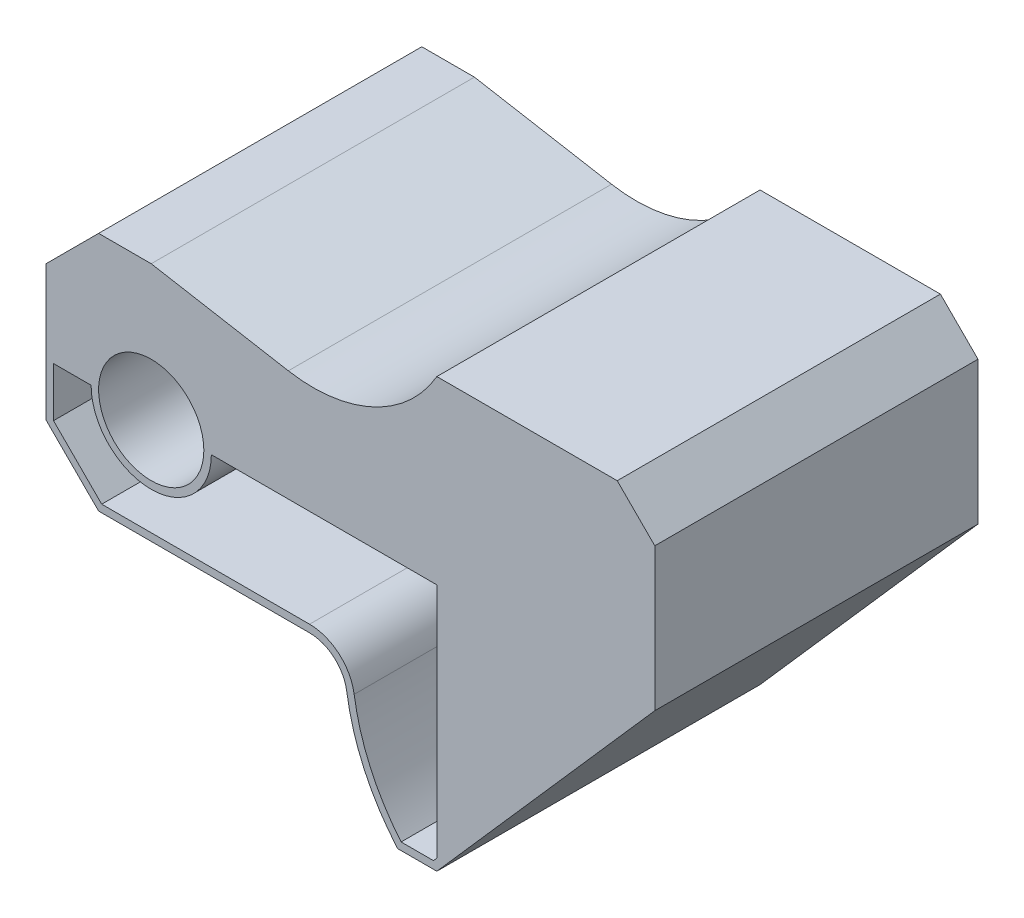
ISO-10303-21;
HEADER;
FILE_DESCRIPTION(('STEP AP214'),'2;1');
FILE_NAME('part.step','',(''),(''),'','','');
FILE_SCHEMA(('AUTOMOTIVE_DESIGN { 1 0 10303 214 1 1 1 1 }'));
ENDSEC;
DATA;
#1=APPLICATION_CONTEXT('core data for automotive mechanical design processes');
#2=APPLICATION_PROTOCOL_DEFINITION('international standard','automotive_design',2000,#1);
#3=PRODUCT_CONTEXT('',#1,'mechanical');
#4=PRODUCT('Part','Part','',(#3));
#5=PRODUCT_RELATED_PRODUCT_CATEGORY('part','',(#4));
#6=PRODUCT_DEFINITION_FORMATION('','',#4);
#7=PRODUCT_DEFINITION_CONTEXT('part definition',#1,'design');
#8=PRODUCT_DEFINITION('design','',#6,#7);
#9=PRODUCT_DEFINITION_SHAPE('','',#8);
#10=(LENGTH_UNIT() NAMED_UNIT(*) SI_UNIT(.MILLI.,.METRE.));
#11=(NAMED_UNIT(*) PLANE_ANGLE_UNIT() SI_UNIT($,.RADIAN.));
#12=(NAMED_UNIT(*) SI_UNIT($,.STERADIAN.) SOLID_ANGLE_UNIT());
#13=UNCERTAINTY_MEASURE_WITH_UNIT(LENGTH_MEASURE(1.E-05),#10,'distance_accuracy_value','');
#14=(GEOMETRIC_REPRESENTATION_CONTEXT(3) GLOBAL_UNCERTAINTY_ASSIGNED_CONTEXT((#13)) GLOBAL_UNIT_ASSIGNED_CONTEXT((#10,
#11,#12)) REPRESENTATION_CONTEXT('',''));
#15=CARTESIAN_POINT('',(0.,0.,0.));
#16=DIRECTION('',(0.,0.,1.));
#17=DIRECTION('',(1.,0.,0.));
#18=AXIS2_PLACEMENT_3D('',#15,#16,#17);
#19=CARTESIAN_POINT('',(21.0666262553692,-19.,43.));
#20=DIRECTION('',(0.,0.,-1.));
#21=DIRECTION('',(-1.,0.,0.));
#22=AXIS2_PLACEMENT_3D('',#19,#20,#21);
#23=PLANE('',#22);
#24=DIRECTION('',(1.,0.,0.));
#25=VECTOR('',#24,1.);
#26=CARTESIAN_POINT('',(-6.58578643762697,-13.,43.));
#27=LINE('',#26,#25);
#28=CARTESIAN_POINT('',(-6.58578643762697,-13.,43.));
#29=VERTEX_POINT('',#28);
#30=CARTESIAN_POINT('',(21.0666262553692,-13.,43.));
#31=VERTEX_POINT('',#30);
#32=EDGE_CURVE('E366',#29,#31,#27,.T.);
#33=ORIENTED_EDGE('',*,*,#32,.F.);
#34=DIRECTION('',(0.707106781186544,-0.707106781186551,0.));
#35=VECTOR('',#34,1.);
#36=CARTESIAN_POINT('',(-13.,-6.58578643762691,43.));
#37=LINE('',#36,#35);
#38=CARTESIAN_POINT('',(-13.,-6.58578643762691,43.));
#39=VERTEX_POINT('',#38);
#40=EDGE_CURVE('E363',#39,#29,#37,.T.);
#41=ORIENTED_EDGE('',*,*,#40,.F.);
#42=DIRECTION('',(0.,-1.,0.));
#43=VECTOR('',#42,1.);
#44=CARTESIAN_POINT('',(-13.,0.,43.));
#45=LINE('',#44,#43);
#46=CARTESIAN_POINT('',(-13.,0.,43.));
#47=VERTEX_POINT('',#46);
#48=EDGE_CURVE('E360',#47,#39,#45,.T.);
#49=ORIENTED_EDGE('',*,*,#48,.F.);
#50=DIRECTION('',(-1.,0.,0.));
#51=VECTOR('',#50,1.);
#52=CARTESIAN_POINT('',(-8.,0.,43.));
#53=LINE('',#52,#51);
#54=CARTESIAN_POINT('',(-8.,0.,43.));
#55=VERTEX_POINT('',#54);
#56=EDGE_CURVE('E51',#55,#47,#53,.T.);
#57=ORIENTED_EDGE('',*,*,#56,.F.);
#58=CARTESIAN_POINT('',(0.,0.,43.));
#59=DIRECTION('',(0.,0.,-1.));
#60=DIRECTION('',(1.,0.,0.));
#61=AXIS2_PLACEMENT_3D('',#58,#59,#60);
#62=CIRCLE('',#61,8.);
#63=CARTESIAN_POINT('',(8.,0.,43.));
#64=VERTEX_POINT('',#63);
#65=EDGE_CURVE('E387',#64,#55,#62,.T.);
#66=ORIENTED_EDGE('',*,*,#65,.F.);
#67=DIRECTION('',(-1.,0.,0.));
#68=VECTOR('',#67,1.);
#69=CARTESIAN_POINT('',(8.,0.,43.));
#70=LINE('',#69,#68);
#71=CARTESIAN_POINT('',(38.,0.,43.));
#72=VERTEX_POINT('',#71);
#73=EDGE_CURVE('E384',#72,#64,#70,.T.);
#74=ORIENTED_EDGE('',*,*,#73,.F.);
#75=DIRECTION('',(0.,1.,0.));
#76=VECTOR('',#75,1.);
#77=CARTESIAN_POINT('',(38.,0.,43.));
#78=LINE('',#77,#76);
#79=CARTESIAN_POINT('',(38.,-31.4851115423111,43.));
#80=VERTEX_POINT('',#79);
#81=EDGE_CURVE('E381',#80,#72,#78,.T.);
#82=ORIENTED_EDGE('',*,*,#81,.F.);
#83=DIRECTION('',(0.660114607728678,0.751164898449877,0.));
#84=VECTOR('',#83,1.);
#85=CARTESIAN_POINT('',(37.5475222644552,-32.,43.));
#86=LINE('',#85,#84);
#87=CARTESIAN_POINT('',(37.5475222644552,-32.,43.));
#88=VERTEX_POINT('',#87);
#89=EDGE_CURVE('E378',#88,#80,#86,.T.);
#90=ORIENTED_EDGE('',*,*,#89,.F.);
#91=DIRECTION('',(1.,0.,0.));
#92=VECTOR('',#91,1.);
#93=CARTESIAN_POINT('',(33.2493591074425,-32.,43.));
#94=LINE('',#93,#92);
#95=CARTESIAN_POINT('',(33.2493591074425,-32.,43.));
#96=VERTEX_POINT('',#95);
#97=EDGE_CURVE('E375',#96,#88,#94,.T.);
#98=ORIENTED_EDGE('',*,*,#97,.F.);
#99=CARTESIAN_POINT('',(54.6969696969697,-14.,43.));
#100=DIRECTION('',(0.,0.,1.));
#101=DIRECTION('',(1.,0.,0.));
#102=AXIS2_PLACEMENT_3D('',#99,#100,#101);
#103=CIRCLE('',#102,28.);
#104=CARTESIAN_POINT('',(27.0013927450634,-18.1176470588235,43.));
#105=VERTEX_POINT('',#104);
#106=EDGE_CURVE('E372',#105,#96,#103,.T.);
#107=ORIENTED_EDGE('',*,*,#106,.F.);
#108=CARTESIAN_POINT('',(21.0666262553692,-19.,43.));
#109=DIRECTION('',(0.,0.,-1.));
#110=DIRECTION('',(1.,0.,0.));
#111=AXIS2_PLACEMENT_3D('',#108,#109,#110);
#112=CIRCLE('',#111,6.);
#113=EDGE_CURVE('E369',#31,#105,#112,.T.);
#114=ORIENTED_EDGE('',*,*,#113,.F.);
#115=EDGE_LOOP('',(#33,#41,#49,#57,#66,#74,#82,#90,#98,#107,#114));
#116=FACE_BOUND('',#115,.T.);
#117=DIRECTION('',(0.707106781186544,-0.707106781186551,0.));
#118=VECTOR('',#117,1.);
#119=CARTESIAN_POINT('',(-14.,-7.,43.));
#120=LINE('',#119,#118);
#121=CARTESIAN_POINT('',(-14.,-7.,43.));
#122=VERTEX_POINT('',#121);
#123=CARTESIAN_POINT('',(-7.00000000000007,-14.,43.));
#124=VERTEX_POINT('',#123);
#125=EDGE_CURVE('E209',#122,#124,#120,.T.);
#126=ORIENTED_EDGE('',*,*,#125,.T.);
#127=DIRECTION('',(1.,0.,0.));
#128=VECTOR('',#127,1.);
#129=CARTESIAN_POINT('',(-7.00000000000007,-14.,43.));
#130=LINE('',#129,#128);
#131=CARTESIAN_POINT('',(21.0666262553692,-14.,43.));
#132=VERTEX_POINT('',#131);
#133=EDGE_CURVE('E119',#124,#132,#130,.T.);
#134=ORIENTED_EDGE('',*,*,#133,.T.);
#135=CARTESIAN_POINT('',(21.0666262553692,-19.,43.));
#136=DIRECTION('',(0.,0.,-1.));
#137=DIRECTION('',(-1.,0.,0.));
#138=AXIS2_PLACEMENT_3D('',#135,#136,#137);
#139=CIRCLE('',#138,5.);
#140=CARTESIAN_POINT('',(26.0122649967811,-18.2647058823529,43.));
#141=VERTEX_POINT('',#140);
#142=EDGE_CURVE('E242',#132,#141,#139,.T.);
#143=ORIENTED_EDGE('',*,*,#142,.T.);
#144=CARTESIAN_POINT('',(54.6969696969697,-14.,43.));
#145=DIRECTION('',(0.,0.,1.));
#146=DIRECTION('',(1.,0.,0.));
#147=AXIS2_PLACEMENT_3D('',#144,#145,#146);
#148=CIRCLE('',#147,29.);
#149=CARTESIAN_POINT('',(32.7880673967631,-33.,43.));
#150=VERTEX_POINT('',#149);
#151=EDGE_CURVE('E261',#141,#150,#148,.T.);
#152=ORIENTED_EDGE('',*,*,#151,.T.);
#153=DIRECTION('',(1.,0.,0.));
#154=VECTOR('',#153,1.);
#155=CARTESIAN_POINT('',(38.,-33.,43.));
#156=LINE('',#155,#154);
#157=CARTESIAN_POINT('',(38.,-33.,43.));
#158=VERTEX_POINT('',#157);
#159=EDGE_CURVE('E258',#150,#158,#156,.T.);
#160=ORIENTED_EDGE('',*,*,#159,.T.);
#161=DIRECTION('',(0.660114607728679,0.751164898449876,0.));
#162=VECTOR('',#161,1.);
#163=CARTESIAN_POINT('',(67.,0.,43.));
#164=LINE('',#163,#162);
#165=CARTESIAN_POINT('',(67.,0.,43.));
#166=VERTEX_POINT('',#165);
#167=EDGE_CURVE('E260',#158,#166,#164,.T.);
#168=ORIENTED_EDGE('',*,*,#167,.T.);
#169=DIRECTION('',(0.,1.,0.));
#170=VECTOR('',#169,1.);
#171=CARTESIAN_POINT('',(67.,19.,43.));
#172=LINE('',#171,#170);
#173=CARTESIAN_POINT('',(67.,19.,43.));
#174=VERTEX_POINT('',#173);
#175=EDGE_CURVE('E263',#166,#174,#172,.T.);
#176=ORIENTED_EDGE('',*,*,#175,.T.);
#177=DIRECTION('',(-0.707106781186547,0.707106781186548,0.));
#178=VECTOR('',#177,1.);
#179=CARTESIAN_POINT('',(62.,24.,43.));
#180=LINE('',#179,#178);
#181=CARTESIAN_POINT('',(62.,24.,43.));
#182=VERTEX_POINT('',#181);
#183=EDGE_CURVE('E269',#174,#182,#180,.T.);
#184=ORIENTED_EDGE('',*,*,#183,.T.);
#185=DIRECTION('',(-1.,0.,0.));
#186=VECTOR('',#185,1.);
#187=CARTESIAN_POINT('',(38.,24.,43.));
#188=LINE('',#187,#186);
#189=CARTESIAN_POINT('',(38.,24.,43.));
#190=VERTEX_POINT('',#189);
#191=EDGE_CURVE('E271',#182,#190,#188,.T.);
#192=ORIENTED_EDGE('',*,*,#191,.T.);
#193=CARTESIAN_POINT('',(21.5424003635473,33.4945992125119,43.));
#194=DIRECTION('',(0.,0.,-1.));
#195=DIRECTION('',(1.,0.,0.));
#196=AXIS2_PLACEMENT_3D('',#193,#194,#195);
#197=CIRCLE('',#196,19.);
#198=CARTESIAN_POINT('',(18.2430849878756,14.78325190528,43.));
#199=VERTEX_POINT('',#198);
#200=EDGE_CURVE('E273',#190,#199,#197,.T.);
#201=ORIENTED_EDGE('',*,*,#200,.T.);
#202=DIRECTION('',(-0.984807753012208,0.173648177666931,0.));
#203=VECTOR('',#202,1.);
#204=CARTESIAN_POINT('',(0.,18.,43.));
#205=LINE('',#204,#203);
#206=CARTESIAN_POINT('',(0.,18.,43.));
#207=VERTEX_POINT('',#206);
#208=EDGE_CURVE('E160',#199,#207,#205,.T.);
#209=ORIENTED_EDGE('',*,*,#208,.T.);
#210=DIRECTION('',(-1.,0.,0.));
#211=VECTOR('',#210,1.);
#212=CARTESIAN_POINT('',(-6.99999999999998,18.,43.));
#213=LINE('',#212,#211);
#214=CARTESIAN_POINT('',(-6.99999999999998,18.,43.));
#215=VERTEX_POINT('',#214);
#216=EDGE_CURVE('E153',#207,#215,#213,.T.);
#217=ORIENTED_EDGE('',*,*,#216,.T.);
#218=DIRECTION('',(-0.707106781186549,-0.707106781186546,0.));
#219=VECTOR('',#218,1.);
#220=CARTESIAN_POINT('',(-14.,11.,43.));
#221=LINE('',#220,#219);
#222=CARTESIAN_POINT('',(-14.,11.,43.));
#223=VERTEX_POINT('',#222);
#224=EDGE_CURVE('E157',#215,#223,#221,.T.);
#225=ORIENTED_EDGE('',*,*,#224,.T.);
#226=DIRECTION('',(0.,-1.,0.));
#227=VECTOR('',#226,1.);
#228=CARTESIAN_POINT('',(-14.,-7.,43.));
#229=LINE('',#228,#227);
#230=EDGE_CURVE('E60',#223,#122,#229,.T.);
#231=ORIENTED_EDGE('',*,*,#230,.T.);
#232=EDGE_LOOP('',(#126,#134,#143,#152,#160,#168,#176,#184,#192,#201,#209,#217,#225,#231));
#233=FACE_BOUND('',#232,.T.);
#234=CARTESIAN_POINT('',(0.,0.,43.));
#235=DIRECTION('',(0.,0.,1.));
#236=DIRECTION('',(1.,0.,0.));
#237=AXIS2_PLACEMENT_3D('',#234,#235,#236);
#238=CIRCLE('',#237,7.);
#239=CARTESIAN_POINT('',(7.,0.,43.));
#240=VERTEX_POINT('',#239);
#241=EDGE_CURVE('E185',#240,#240,#238,.T.);
#242=ORIENTED_EDGE('',*,*,#241,.F.);
#243=EDGE_LOOP('',(#242));
#244=FACE_BOUND('',#243,.T.);
#245=ADVANCED_FACE('F36',(#116,#233,#244),#23,.F.);
#246=CARTESIAN_POINT('',(21.0666262553692,-19.,0.));
#247=DIRECTION('',(0.,0.,-1.));
#248=DIRECTION('',(-1.,0.,0.));
#249=AXIS2_PLACEMENT_3D('',#246,#247,#248);
#250=PLANE('',#249);
#251=DIRECTION('',(0.707106781186544,-0.707106781186551,0.));
#252=VECTOR('',#251,1.);
#253=CARTESIAN_POINT('',(-14.,-7.,0.));
#254=LINE('',#253,#252);
#255=CARTESIAN_POINT('',(-14.,-7.,0.));
#256=VERTEX_POINT('',#255);
#257=CARTESIAN_POINT('',(-7.00000000000007,-14.,0.));
#258=VERTEX_POINT('',#257);
#259=EDGE_CURVE('E181',#256,#258,#254,.T.);
#260=ORIENTED_EDGE('',*,*,#259,.F.);
#261=DIRECTION('',(0.,-1.,0.));
#262=VECTOR('',#261,1.);
#263=CARTESIAN_POINT('',(-14.,-7.,0.));
#264=LINE('',#263,#262);
#265=CARTESIAN_POINT('',(-14.,11.,0.));
#266=VERTEX_POINT('',#265);
#267=EDGE_CURVE('E111',#266,#256,#264,.T.);
#268=ORIENTED_EDGE('',*,*,#267,.F.);
#269=DIRECTION('',(-0.707106781186549,-0.707106781186546,0.));
#270=VECTOR('',#269,1.);
#271=CARTESIAN_POINT('',(-14.,11.,0.));
#272=LINE('',#271,#270);
#273=CARTESIAN_POINT('',(-6.99999999999998,18.,0.));
#274=VERTEX_POINT('',#273);
#275=EDGE_CURVE('E206',#274,#266,#272,.T.);
#276=ORIENTED_EDGE('',*,*,#275,.F.);
#277=DIRECTION('',(-1.,0.,0.));
#278=VECTOR('',#277,1.);
#279=CARTESIAN_POINT('',(-6.99999999999998,18.,0.));
#280=LINE('',#279,#278);
#281=CARTESIAN_POINT('',(0.,18.,0.));
#282=VERTEX_POINT('',#281);
#283=EDGE_CURVE('E169',#282,#274,#280,.T.);
#284=ORIENTED_EDGE('',*,*,#283,.F.);
#285=DIRECTION('',(-0.984807753012208,0.173648177666931,0.));
#286=VECTOR('',#285,1.);
#287=CARTESIAN_POINT('',(0.,18.,0.));
#288=LINE('',#287,#286);
#289=CARTESIAN_POINT('',(18.2430849878756,14.78325190528,0.));
#290=VERTEX_POINT('',#289);
#291=EDGE_CURVE('E203',#290,#282,#288,.T.);
#292=ORIENTED_EDGE('',*,*,#291,.F.);
#293=CARTESIAN_POINT('',(21.5424003635473,33.4945992125119,0.));
#294=DIRECTION('',(0.,0.,-1.));
#295=DIRECTION('',(1.,0.,0.));
#296=AXIS2_PLACEMENT_3D('',#293,#294,#295);
#297=CIRCLE('',#296,19.);
#298=CARTESIAN_POINT('',(38.,24.,0.));
#299=VERTEX_POINT('',#298);
#300=EDGE_CURVE('E201',#299,#290,#297,.T.);
#301=ORIENTED_EDGE('',*,*,#300,.F.);
#302=DIRECTION('',(-1.,0.,0.));
#303=VECTOR('',#302,1.);
#304=CARTESIAN_POINT('',(38.,24.,0.));
#305=LINE('',#304,#303);
#306=CARTESIAN_POINT('',(62.,24.,0.));
#307=VERTEX_POINT('',#306);
#308=EDGE_CURVE('E199',#307,#299,#305,.T.);
#309=ORIENTED_EDGE('',*,*,#308,.F.);
#310=DIRECTION('',(-0.707106781186547,0.707106781186548,0.));
#311=VECTOR('',#310,1.);
#312=CARTESIAN_POINT('',(62.,24.,0.));
#313=LINE('',#312,#311);
#314=CARTESIAN_POINT('',(67.,19.,0.));
#315=VERTEX_POINT('',#314);
#316=EDGE_CURVE('E197',#315,#307,#313,.T.);
#317=ORIENTED_EDGE('',*,*,#316,.F.);
#318=DIRECTION('',(0.,1.,0.));
#319=VECTOR('',#318,1.);
#320=CARTESIAN_POINT('',(67.,19.,0.));
#321=LINE('',#320,#319);
#322=CARTESIAN_POINT('',(67.,0.,0.));
#323=VERTEX_POINT('',#322);
#324=EDGE_CURVE('E195',#323,#315,#321,.T.);
#325=ORIENTED_EDGE('',*,*,#324,.F.);
#326=DIRECTION('',(0.660114607728679,0.751164898449876,0.));
#327=VECTOR('',#326,1.);
#328=CARTESIAN_POINT('',(67.,0.,0.));
#329=LINE('',#328,#327);
#330=CARTESIAN_POINT('',(38.,-33.,0.));
#331=VERTEX_POINT('',#330);
#332=EDGE_CURVE('E193',#331,#323,#329,.T.);
#333=ORIENTED_EDGE('',*,*,#332,.F.);
#334=DIRECTION('',(1.,0.,0.));
#335=VECTOR('',#334,1.);
#336=CARTESIAN_POINT('',(38.,-33.,0.));
#337=LINE('',#336,#335);
#338=CARTESIAN_POINT('',(32.7880673967631,-33.,0.));
#339=VERTEX_POINT('',#338);
#340=EDGE_CURVE('E191',#339,#331,#337,.T.);
#341=ORIENTED_EDGE('',*,*,#340,.F.);
#342=CARTESIAN_POINT('',(54.6969696969697,-14.,0.));
#343=DIRECTION('',(0.,0.,1.));
#344=DIRECTION('',(1.,0.,0.));
#345=AXIS2_PLACEMENT_3D('',#342,#343,#344);
#346=CIRCLE('',#345,29.);
#347=CARTESIAN_POINT('',(26.0122649967811,-18.2647058823529,0.));
#348=VERTEX_POINT('',#347);
#349=EDGE_CURVE('E189',#348,#339,#346,.T.);
#350=ORIENTED_EDGE('',*,*,#349,.F.);
#351=CARTESIAN_POINT('',(21.0666262553692,-19.,0.));
#352=DIRECTION('',(0.,0.,-1.));
#353=DIRECTION('',(-1.,0.,0.));
#354=AXIS2_PLACEMENT_3D('',#351,#352,#353);
#355=CIRCLE('',#354,5.);
#356=CARTESIAN_POINT('',(21.0666262553692,-14.,0.));
#357=VERTEX_POINT('',#356);
#358=EDGE_CURVE('E187',#357,#348,#355,.T.);
#359=ORIENTED_EDGE('',*,*,#358,.F.);
#360=DIRECTION('',(1.,0.,0.));
#361=VECTOR('',#360,1.);
#362=CARTESIAN_POINT('',(-7.00000000000007,-14.,0.));
#363=LINE('',#362,#361);
#364=EDGE_CURVE('E184',#258,#357,#363,.T.);
#365=ORIENTED_EDGE('',*,*,#364,.F.);
#366=EDGE_LOOP('',(#260,#268,#276,#284,#292,#301,#309,#317,#325,#333,#341,#350,#359,#365));
#367=FACE_BOUND('',#366,.T.);
#368=CARTESIAN_POINT('',(0.,0.,0.));
#369=DIRECTION('',(0.,0.,1.));
#370=DIRECTION('',(1.,0.,0.));
#371=AXIS2_PLACEMENT_3D('',#368,#369,#370);
#372=CIRCLE('',#371,7.);
#373=CARTESIAN_POINT('',(7.,0.,0.));
#374=VERTEX_POINT('',#373);
#375=EDGE_CURVE('E291',#374,#374,#372,.T.);
#376=ORIENTED_EDGE('',*,*,#375,.T.);
#377=EDGE_LOOP('',(#376));
#378=FACE_BOUND('',#377,.T.);
#379=ADVANCED_FACE('F246',(#367,#378),#250,.T.);
#380=CARTESIAN_POINT('',(-14.,-7.,43.));
#381=DIRECTION('',(0.707106781186551,0.707106781186544,0.));
#382=DIRECTION('',(-0.707106781186544,0.707106781186551,0.));
#383=AXIS2_PLACEMENT_3D('',#380,#381,#382);
#384=PLANE('',#383);
#385=ORIENTED_EDGE('',*,*,#259,.T.);
#386=DIRECTION('',(0.,0.,-1.));
#387=VECTOR('',#386,1.);
#388=CARTESIAN_POINT('',(-7.00000000000007,-14.,43.));
#389=LINE('',#388,#387);
#390=EDGE_CURVE('E12',#124,#258,#389,.T.);
#391=ORIENTED_EDGE('',*,*,#390,.F.);
#392=ORIENTED_EDGE('',*,*,#125,.F.);
#393=DIRECTION('',(0.,0.,-1.));
#394=VECTOR('',#393,1.);
#395=CARTESIAN_POINT('',(-14.,-7.,43.));
#396=LINE('',#395,#394);
#397=EDGE_CURVE('E177',#122,#256,#396,.T.);
#398=ORIENTED_EDGE('',*,*,#397,.T.);
#399=EDGE_LOOP('',(#385,#391,#392,#398));
#400=FACE_BOUND('',#399,.T.);
#401=ADVANCED_FACE('F38',(#400),#384,.F.);
#402=CARTESIAN_POINT('',(-7.00000000000007,-14.,43.));
#403=DIRECTION('',(0.,1.,0.));
#404=DIRECTION('',(0.,0.,1.));
#405=AXIS2_PLACEMENT_3D('',#402,#403,#404);
#406=PLANE('',#405);
#407=ORIENTED_EDGE('',*,*,#364,.T.);
#408=DIRECTION('',(0.,0.,-1.));
#409=VECTOR('',#408,1.);
#410=CARTESIAN_POINT('',(21.0666262553692,-14.,43.));
#411=LINE('',#410,#409);
#412=EDGE_CURVE('E44',#132,#357,#411,.T.);
#413=ORIENTED_EDGE('',*,*,#412,.F.);
#414=ORIENTED_EDGE('',*,*,#133,.F.);
#415=ORIENTED_EDGE('',*,*,#390,.T.);
#416=EDGE_LOOP('',(#407,#413,#414,#415));
#417=FACE_BOUND('',#416,.T.);
#418=ADVANCED_FACE('F518',(#417),#406,.F.);
#419=CARTESIAN_POINT('',(21.0666262553692,-19.,43.));
#420=DIRECTION('',(0.,0.,-1.));
#421=DIRECTION('',(-1.,0.,0.));
#422=AXIS2_PLACEMENT_3D('',#419,#420,#421);
#423=CYLINDRICAL_SURFACE('',#422,5.);
#424=ORIENTED_EDGE('',*,*,#358,.T.);
#425=DIRECTION('',(0.,0.,-1.));
#426=VECTOR('',#425,1.);
#427=CARTESIAN_POINT('',(26.0122649967811,-18.2647058823529,43.));
#428=LINE('',#427,#426);
#429=EDGE_CURVE('E234',#141,#348,#428,.T.);
#430=ORIENTED_EDGE('',*,*,#429,.F.);
#431=ORIENTED_EDGE('',*,*,#142,.F.);
#432=ORIENTED_EDGE('',*,*,#412,.T.);
#433=EDGE_LOOP('',(#424,#430,#431,#432));
#434=FACE_BOUND('',#433,.T.);
#435=ADVANCED_FACE('F240',(#434),#423,.F.);
#436=CARTESIAN_POINT('',(54.6969696969697,-14.,43.));
#437=DIRECTION('',(0.,0.,-1.));
#438=DIRECTION('',(-1.,0.,0.));
#439=AXIS2_PLACEMENT_3D('',#436,#437,#438);
#440=CYLINDRICAL_SURFACE('',#439,29.);
#441=ORIENTED_EDGE('',*,*,#349,.T.);
#442=DIRECTION('',(0.,0.,-1.));
#443=VECTOR('',#442,1.);
#444=CARTESIAN_POINT('',(32.7880673967631,-33.,43.));
#445=LINE('',#444,#443);
#446=EDGE_CURVE('E231',#150,#339,#445,.T.);
#447=ORIENTED_EDGE('',*,*,#446,.F.);
#448=ORIENTED_EDGE('',*,*,#151,.F.);
#449=ORIENTED_EDGE('',*,*,#429,.T.);
#450=EDGE_LOOP('',(#441,#447,#448,#449));
#451=FACE_BOUND('',#450,.T.);
#452=ADVANCED_FACE('F252',(#451),#440,.T.);
#453=CARTESIAN_POINT('',(38.,-33.,43.));
#454=DIRECTION('',(0.,1.,0.));
#455=DIRECTION('',(0.,0.,1.));
#456=AXIS2_PLACEMENT_3D('',#453,#454,#455);
#457=PLANE('',#456);
#458=ORIENTED_EDGE('',*,*,#340,.T.);
#459=DIRECTION('',(0.,0.,-1.));
#460=VECTOR('',#459,1.);
#461=CARTESIAN_POINT('',(38.,-33.,43.));
#462=LINE('',#461,#460);
#463=EDGE_CURVE('E228',#158,#331,#462,.T.);
#464=ORIENTED_EDGE('',*,*,#463,.F.);
#465=ORIENTED_EDGE('',*,*,#159,.F.);
#466=ORIENTED_EDGE('',*,*,#446,.T.);
#467=EDGE_LOOP('',(#458,#464,#465,#466));
#468=FACE_BOUND('',#467,.T.);
#469=ADVANCED_FACE('F256',(#468),#457,.F.);
#470=CARTESIAN_POINT('',(67.,0.,43.));
#471=DIRECTION('',(-0.751164898449876,0.660114607728679,0.));
#472=DIRECTION('',(-0.660114607728679,-0.751164898449876,0.));
#473=AXIS2_PLACEMENT_3D('',#470,#471,#472);
#474=PLANE('',#473);
#475=ORIENTED_EDGE('',*,*,#332,.T.);
#476=DIRECTION('',(0.,0.,-1.));
#477=VECTOR('',#476,1.);
#478=CARTESIAN_POINT('',(67.,0.,43.));
#479=LINE('',#478,#477);
#480=EDGE_CURVE('E225',#166,#323,#479,.T.);
#481=ORIENTED_EDGE('',*,*,#480,.F.);
#482=ORIENTED_EDGE('',*,*,#167,.F.);
#483=ORIENTED_EDGE('',*,*,#463,.T.);
#484=EDGE_LOOP('',(#475,#481,#482,#483));
#485=FACE_BOUND('',#484,.T.);
#486=ADVANCED_FACE('F508',(#485),#474,.F.);
#487=CARTESIAN_POINT('',(67.,19.,43.));
#488=DIRECTION('',(-1.,0.,0.));
#489=DIRECTION('',(0.,0.,1.));
#490=AXIS2_PLACEMENT_3D('',#487,#488,#489);
#491=PLANE('',#490);
#492=ORIENTED_EDGE('',*,*,#324,.T.);
#493=DIRECTION('',(0.,0.,-1.));
#494=VECTOR('',#493,1.);
#495=CARTESIAN_POINT('',(67.,19.,43.));
#496=LINE('',#495,#494);
#497=EDGE_CURVE('E222',#174,#315,#496,.T.);
#498=ORIENTED_EDGE('',*,*,#497,.F.);
#499=ORIENTED_EDGE('',*,*,#175,.F.);
#500=ORIENTED_EDGE('',*,*,#480,.T.);
#501=EDGE_LOOP('',(#492,#498,#499,#500));
#502=FACE_BOUND('',#501,.T.);
#503=ADVANCED_FACE('F504',(#502),#491,.F.);
#504=CARTESIAN_POINT('',(62.,24.,43.));
#505=DIRECTION('',(-0.707106781186548,-0.707106781186547,0.));
#506=DIRECTION('',(0.707106781186547,-0.707106781186548,0.));
#507=AXIS2_PLACEMENT_3D('',#504,#505,#506);
#508=PLANE('',#507);
#509=ORIENTED_EDGE('',*,*,#316,.T.);
#510=DIRECTION('',(0.,0.,-1.));
#511=VECTOR('',#510,1.);
#512=CARTESIAN_POINT('',(62.,24.,43.));
#513=LINE('',#512,#511);
#514=EDGE_CURVE('E219',#182,#307,#513,.T.);
#515=ORIENTED_EDGE('',*,*,#514,.F.);
#516=ORIENTED_EDGE('',*,*,#183,.F.);
#517=ORIENTED_EDGE('',*,*,#497,.T.);
#518=EDGE_LOOP('',(#509,#515,#516,#517));
#519=FACE_BOUND('',#518,.T.);
#520=ADVANCED_FACE('F500',(#519),#508,.F.);
#521=CARTESIAN_POINT('',(38.,24.,43.));
#522=DIRECTION('',(0.,-1.,0.));
#523=DIRECTION('',(0.,0.,-1.));
#524=AXIS2_PLACEMENT_3D('',#521,#522,#523);
#525=PLANE('',#524);
#526=ORIENTED_EDGE('',*,*,#308,.T.);
#527=DIRECTION('',(0.,0.,-1.));
#528=VECTOR('',#527,1.);
#529=CARTESIAN_POINT('',(38.,24.,43.));
#530=LINE('',#529,#528);
#531=EDGE_CURVE('E216',#190,#299,#530,.T.);
#532=ORIENTED_EDGE('',*,*,#531,.F.);
#533=ORIENTED_EDGE('',*,*,#191,.F.);
#534=ORIENTED_EDGE('',*,*,#514,.T.);
#535=EDGE_LOOP('',(#526,#532,#533,#534));
#536=FACE_BOUND('',#535,.T.);
#537=ADVANCED_FACE('F497',(#536),#525,.F.);
#538=CARTESIAN_POINT('',(21.5424003635473,33.4945992125119,43.));
#539=DIRECTION('',(0.,0.,-1.));
#540=DIRECTION('',(-1.,0.,0.));
#541=AXIS2_PLACEMENT_3D('',#538,#539,#540);
#542=CYLINDRICAL_SURFACE('',#541,19.);
#543=ORIENTED_EDGE('',*,*,#300,.T.);
#544=DIRECTION('',(0.,0.,-1.));
#545=VECTOR('',#544,1.);
#546=CARTESIAN_POINT('',(18.2430849878756,14.78325190528,43.));
#547=LINE('',#546,#545);
#548=EDGE_CURVE('E213',#199,#290,#547,.T.);
#549=ORIENTED_EDGE('',*,*,#548,.F.);
#550=ORIENTED_EDGE('',*,*,#200,.F.);
#551=ORIENTED_EDGE('',*,*,#531,.T.);
#552=EDGE_LOOP('',(#543,#549,#550,#551));
#553=FACE_BOUND('',#552,.T.);
#554=ADVANCED_FACE('F279',(#553),#542,.F.);
#555=CARTESIAN_POINT('',(0.,18.,43.));
#556=DIRECTION('',(-0.173648177666931,-0.984807753012208,0.));
#557=DIRECTION('',(0.984807753012208,-0.173648177666931,0.));
#558=AXIS2_PLACEMENT_3D('',#555,#556,#557);
#559=PLANE('',#558);
#560=ORIENTED_EDGE('',*,*,#291,.T.);
#561=DIRECTION('',(0.,0.,-1.));
#562=VECTOR('',#561,1.);
#563=CARTESIAN_POINT('',(0.,18.,43.));
#564=LINE('',#563,#562);
#565=EDGE_CURVE('E172',#207,#282,#564,.T.);
#566=ORIENTED_EDGE('',*,*,#565,.F.);
#567=ORIENTED_EDGE('',*,*,#208,.F.);
#568=ORIENTED_EDGE('',*,*,#548,.T.);
#569=EDGE_LOOP('',(#560,#566,#567,#568));
#570=FACE_BOUND('',#569,.T.);
#571=ADVANCED_FACE('F283',(#570),#559,.F.);
#572=CARTESIAN_POINT('',(-6.99999999999998,18.,43.));
#573=DIRECTION('',(0.,-1.,0.));
#574=DIRECTION('',(0.,0.,-1.));
#575=AXIS2_PLACEMENT_3D('',#572,#573,#574);
#576=PLANE('',#575);
#577=ORIENTED_EDGE('',*,*,#283,.T.);
#578=DIRECTION('',(0.,0.,-1.));
#579=VECTOR('',#578,1.);
#580=CARTESIAN_POINT('',(-6.99999999999998,18.,43.));
#581=LINE('',#580,#579);
#582=EDGE_CURVE('E166',#215,#274,#581,.T.);
#583=ORIENTED_EDGE('',*,*,#582,.F.);
#584=ORIENTED_EDGE('',*,*,#216,.F.);
#585=ORIENTED_EDGE('',*,*,#565,.T.);
#586=EDGE_LOOP('',(#577,#583,#584,#585));
#587=FACE_BOUND('',#586,.T.);
#588=ADVANCED_FACE('F167',(#587),#576,.F.);
#589=CARTESIAN_POINT('',(-14.,11.,43.));
#590=DIRECTION('',(0.707106781186546,-0.707106781186549,0.));
#591=DIRECTION('',(0.707106781186549,0.707106781186546,0.));
#592=AXIS2_PLACEMENT_3D('',#589,#590,#591);
#593=PLANE('',#592);
#594=ORIENTED_EDGE('',*,*,#275,.T.);
#595=DIRECTION('',(0.,0.,-1.));
#596=VECTOR('',#595,1.);
#597=CARTESIAN_POINT('',(-14.,11.,43.));
#598=LINE('',#597,#596);
#599=EDGE_CURVE('E173',#223,#266,#598,.T.);
#600=ORIENTED_EDGE('',*,*,#599,.F.);
#601=ORIENTED_EDGE('',*,*,#224,.F.);
#602=ORIENTED_EDGE('',*,*,#582,.T.);
#603=EDGE_LOOP('',(#594,#600,#601,#602));
#604=FACE_BOUND('',#603,.T.);
#605=ADVANCED_FACE('F175',(#604),#593,.F.);
#606=CARTESIAN_POINT('',(-14.,-7.,43.));
#607=DIRECTION('',(1.,0.,0.));
#608=DIRECTION('',(0.,1.,0.));
#609=AXIS2_PLACEMENT_3D('',#606,#607,#608);
#610=PLANE('',#609);
#611=ORIENTED_EDGE('',*,*,#267,.T.);
#612=ORIENTED_EDGE('',*,*,#397,.F.);
#613=ORIENTED_EDGE('',*,*,#230,.F.);
#614=ORIENTED_EDGE('',*,*,#599,.T.);
#615=EDGE_LOOP('',(#611,#612,#613,#614));
#616=FACE_BOUND('',#615,.T.);
#617=ADVANCED_FACE('F284',(#616),#610,.F.);
#618=CARTESIAN_POINT('',(0.,0.,43.));
#619=DIRECTION('',(0.,0.,-1.));
#620=DIRECTION('',(-1.,0.,0.));
#621=AXIS2_PLACEMENT_3D('',#618,#619,#620);
#622=CYLINDRICAL_SURFACE('',#621,7.);
#623=ORIENTED_EDGE('',*,*,#241,.T.);
#624=EDGE_LOOP('',(#623));
#625=FACE_BOUND('',#624,.T.);
#626=ORIENTED_EDGE('',*,*,#375,.F.);
#627=EDGE_LOOP('',(#626));
#628=FACE_BOUND('',#627,.T.);
#629=ADVANCED_FACE('F484',(#625,#628),#622,.F.);
#630=CARTESIAN_POINT('',(21.0666262553692,-19.,1.));
#631=DIRECTION('',(0.,0.,-1.));
#632=DIRECTION('',(-1.,0.,0.));
#633=AXIS2_PLACEMENT_3D('',#630,#631,#632);
#634=PLANE('',#633);
#635=DIRECTION('',(0.,-1.,0.));
#636=VECTOR('',#635,1.);
#637=CARTESIAN_POINT('',(-13.,0.,1.));
#638=LINE('',#637,#636);
#639=CARTESIAN_POINT('',(-13.,0.,1.));
#640=VERTEX_POINT('',#639);
#641=CARTESIAN_POINT('',(-13.,-6.58578643762691,1.));
#642=VERTEX_POINT('',#641);
#643=EDGE_CURVE('E299',#640,#642,#638,.T.);
#644=ORIENTED_EDGE('',*,*,#643,.T.);
#645=DIRECTION('',(0.707106781186544,-0.707106781186551,0.));
#646=VECTOR('',#645,1.);
#647=CARTESIAN_POINT('',(-13.,-6.58578643762691,1.));
#648=LINE('',#647,#646);
#649=CARTESIAN_POINT('',(-6.58578643762697,-13.,1.));
#650=VERTEX_POINT('',#649);
#651=EDGE_CURVE('E304',#642,#650,#648,.T.);
#652=ORIENTED_EDGE('',*,*,#651,.T.);
#653=DIRECTION('',(1.,0.,0.));
#654=VECTOR('',#653,1.);
#655=CARTESIAN_POINT('',(-6.58578643762697,-13.,1.));
#656=LINE('',#655,#654);
#657=CARTESIAN_POINT('',(21.0666262553692,-13.,1.));
#658=VERTEX_POINT('',#657);
#659=EDGE_CURVE('E303',#650,#658,#656,.T.);
#660=ORIENTED_EDGE('',*,*,#659,.T.);
#661=CARTESIAN_POINT('',(21.0666262553692,-19.,1.));
#662=DIRECTION('',(0.,0.,-1.));
#663=DIRECTION('',(-1.,0.,0.));
#664=AXIS2_PLACEMENT_3D('',#661,#662,#663);
#665=CIRCLE('',#664,6.);
#666=CARTESIAN_POINT('',(27.0013927450634,-18.1176470588235,1.));
#667=VERTEX_POINT('',#666);
#668=EDGE_CURVE('E308',#658,#667,#665,.T.);
#669=ORIENTED_EDGE('',*,*,#668,.T.);
#670=CARTESIAN_POINT('',(54.6969696969697,-14.,1.));
#671=DIRECTION('',(0.,0.,-1.));
#672=DIRECTION('',(-1.,0.,0.));
#673=AXIS2_PLACEMENT_3D('',#670,#671,#672);
#674=CIRCLE('',#673,28.);
#675=CARTESIAN_POINT('',(33.2493591074425,-32.,1.));
#676=VERTEX_POINT('',#675);
#677=EDGE_CURVE('E312',#667,#676,#674,.F.);
#678=ORIENTED_EDGE('',*,*,#677,.T.);
#679=DIRECTION('',(1.,0.,0.));
#680=VECTOR('',#679,1.);
#681=CARTESIAN_POINT('',(33.2493591074425,-32.,1.));
#682=LINE('',#681,#680);
#683=CARTESIAN_POINT('',(37.5475222644552,-32.,1.));
#684=VERTEX_POINT('',#683);
#685=EDGE_CURVE('E316',#676,#684,#682,.T.);
#686=ORIENTED_EDGE('',*,*,#685,.T.);
#687=DIRECTION('',(0.660114607728678,0.751164898449877,0.));
#688=VECTOR('',#687,1.);
#689=CARTESIAN_POINT('',(37.5475222644552,-32.,1.));
#690=LINE('',#689,#688);
#691=CARTESIAN_POINT('',(38.,-31.4851115423111,1.));
#692=VERTEX_POINT('',#691);
#693=EDGE_CURVE('E320',#684,#692,#690,.T.);
#694=ORIENTED_EDGE('',*,*,#693,.T.);
#695=DIRECTION('',(0.,1.,0.));
#696=VECTOR('',#695,1.);
#697=CARTESIAN_POINT('',(38.,0.,1.));
#698=LINE('',#697,#696);
#699=CARTESIAN_POINT('',(38.,0.,1.));
#700=VERTEX_POINT('',#699);
#701=EDGE_CURVE('E324',#692,#700,#698,.T.);
#702=ORIENTED_EDGE('',*,*,#701,.T.);
#703=DIRECTION('',(-1.,0.,0.));
#704=VECTOR('',#703,1.);
#705=CARTESIAN_POINT('',(8.,0.,1.));
#706=LINE('',#705,#704);
#707=CARTESIAN_POINT('',(8.,0.,1.));
#708=VERTEX_POINT('',#707);
#709=EDGE_CURVE('E328',#700,#708,#706,.T.);
#710=ORIENTED_EDGE('',*,*,#709,.T.);
#711=CARTESIAN_POINT('',(0.,0.,1.));
#712=DIRECTION('',(0.,0.,-1.));
#713=DIRECTION('',(-1.,0.,0.));
#714=AXIS2_PLACEMENT_3D('',#711,#712,#713);
#715=CIRCLE('',#714,8.);
#716=CARTESIAN_POINT('',(-8.,0.,1.));
#717=VERTEX_POINT('',#716);
#718=EDGE_CURVE('E332',#708,#717,#715,.T.);
#719=ORIENTED_EDGE('',*,*,#718,.T.);
#720=DIRECTION('',(-1.,0.,0.));
#721=VECTOR('',#720,1.);
#722=CARTESIAN_POINT('',(-8.,0.,1.));
#723=LINE('',#722,#721);
#724=EDGE_CURVE('E335',#717,#640,#723,.T.);
#725=ORIENTED_EDGE('',*,*,#724,.T.);
#726=EDGE_LOOP('',(#644,#652,#660,#669,#678,#686,#694,#702,#710,#719,#725));
#727=FACE_BOUND('',#726,.T.);
#728=ADVANCED_FACE('F466',(#727),#634,.F.);
#729=CARTESIAN_POINT('',(-13.,-6.58578643762691,-60.2079728939615));
#730=DIRECTION('',(-0.707106781186551,-0.707106781186544,0.));
#731=DIRECTION('',(0.707106781186544,-0.707106781186551,0.));
#732=AXIS2_PLACEMENT_3D('',#729,#730,#731);
#733=PLANE('',#732);
#734=DIRECTION('',(0.,0.,1.));
#735=VECTOR('',#734,1.);
#736=CARTESIAN_POINT('',(-13.,-6.58578643762691,-60.2079728939615));
#737=LINE('',#736,#735);
#738=EDGE_CURVE('E294',#642,#39,#737,.T.);
#739=ORIENTED_EDGE('',*,*,#738,.T.);
#740=ORIENTED_EDGE('',*,*,#40,.T.);
#741=DIRECTION('',(0.,0.,1.));
#742=VECTOR('',#741,1.);
#743=CARTESIAN_POINT('',(-6.58578643762697,-13.,-60.2079728939615));
#744=LINE('',#743,#742);
#745=EDGE_CURVE('E300',#650,#29,#744,.T.);
#746=ORIENTED_EDGE('',*,*,#745,.F.);
#747=ORIENTED_EDGE('',*,*,#651,.F.);
#748=EDGE_LOOP('',(#739,#740,#746,#747));
#749=FACE_BOUND('',#748,.T.);
#750=ADVANCED_FACE('F460',(#749),#733,.F.);
#751=CARTESIAN_POINT('',(-6.58578643762697,-13.,-60.2079728939615));
#752=DIRECTION('',(0.,-1.,0.));
#753=DIRECTION('',(1.,0.,0.));
#754=AXIS2_PLACEMENT_3D('',#751,#752,#753);
#755=PLANE('',#754);
#756=ORIENTED_EDGE('',*,*,#745,.T.);
#757=ORIENTED_EDGE('',*,*,#32,.T.);
#758=DIRECTION('',(0.,0.,1.));
#759=VECTOR('',#758,1.);
#760=CARTESIAN_POINT('',(21.0666262553692,-13.,-60.2079728939615));
#761=LINE('',#760,#759);
#762=EDGE_CURVE('E305',#658,#31,#761,.T.);
#763=ORIENTED_EDGE('',*,*,#762,.F.);
#764=ORIENTED_EDGE('',*,*,#659,.F.);
#765=EDGE_LOOP('',(#756,#757,#763,#764));
#766=FACE_BOUND('',#765,.T.);
#767=ADVANCED_FACE('F458',(#766),#755,.F.);
#768=CARTESIAN_POINT('',(21.0666262553692,-19.,-60.2079728939615));
#769=DIRECTION('',(0.,0.,1.));
#770=DIRECTION('',(1.,0.,0.));
#771=AXIS2_PLACEMENT_3D('',#768,#769,#770);
#772=CYLINDRICAL_SURFACE('',#771,6.);
#773=ORIENTED_EDGE('',*,*,#762,.T.);
#774=ORIENTED_EDGE('',*,*,#113,.T.);
#775=DIRECTION('',(0.,0.,1.));
#776=VECTOR('',#775,1.);
#777=CARTESIAN_POINT('',(27.0013927450634,-18.1176470588235,-60.2079728939615));
#778=LINE('',#777,#776);
#779=EDGE_CURVE('E309',#667,#105,#778,.T.);
#780=ORIENTED_EDGE('',*,*,#779,.F.);
#781=ORIENTED_EDGE('',*,*,#668,.F.);
#782=EDGE_LOOP('',(#773,#774,#780,#781));
#783=FACE_BOUND('',#782,.T.);
#784=ADVANCED_FACE('F463',(#783),#772,.T.);
#785=CARTESIAN_POINT('',(54.6969696969697,-14.,-60.2079728939615));
#786=DIRECTION('',(0.,0.,1.));
#787=DIRECTION('',(1.,0.,0.));
#788=AXIS2_PLACEMENT_3D('',#785,#786,#787);
#789=CYLINDRICAL_SURFACE('',#788,28.);
#790=ORIENTED_EDGE('',*,*,#779,.T.);
#791=ORIENTED_EDGE('',*,*,#106,.T.);
#792=DIRECTION('',(0.,0.,1.));
#793=VECTOR('',#792,1.);
#794=CARTESIAN_POINT('',(33.2493591074425,-32.,-60.2079728939615));
#795=LINE('',#794,#793);
#796=EDGE_CURVE('E313',#676,#96,#795,.T.);
#797=ORIENTED_EDGE('',*,*,#796,.F.);
#798=ORIENTED_EDGE('',*,*,#677,.F.);
#799=EDGE_LOOP('',(#790,#791,#797,#798));
#800=FACE_BOUND('',#799,.T.);
#801=ADVANCED_FACE('F635',(#800),#789,.F.);
#802=CARTESIAN_POINT('',(33.2493591074425,-32.,-60.2079728939615));
#803=DIRECTION('',(0.,-1.,0.));
#804=DIRECTION('',(0.,0.,-1.));
#805=AXIS2_PLACEMENT_3D('',#802,#803,#804);
#806=PLANE('',#805);
#807=ORIENTED_EDGE('',*,*,#796,.T.);
#808=ORIENTED_EDGE('',*,*,#97,.T.);
#809=DIRECTION('',(0.,0.,1.));
#810=VECTOR('',#809,1.);
#811=CARTESIAN_POINT('',(37.5475222644552,-32.,-60.2079728939615));
#812=LINE('',#811,#810);
#813=EDGE_CURVE('E317',#684,#88,#812,.T.);
#814=ORIENTED_EDGE('',*,*,#813,.F.);
#815=ORIENTED_EDGE('',*,*,#685,.F.);
#816=EDGE_LOOP('',(#807,#808,#814,#815));
#817=FACE_BOUND('',#816,.T.);
#818=ADVANCED_FACE('F643',(#817),#806,.F.);
#819=CARTESIAN_POINT('',(37.5475222644552,-32.,-60.2079728939615));
#820=DIRECTION('',(0.751164898449877,-0.660114607728678,0.));
#821=DIRECTION('',(0.660114607728678,0.751164898449877,0.));
#822=AXIS2_PLACEMENT_3D('',#819,#820,#821);
#823=PLANE('',#822);
#824=ORIENTED_EDGE('',*,*,#813,.T.);
#825=ORIENTED_EDGE('',*,*,#89,.T.);
#826=DIRECTION('',(0.,0.,1.));
#827=VECTOR('',#826,1.);
#828=CARTESIAN_POINT('',(38.,-31.4851115423111,-60.2079728939615));
#829=LINE('',#828,#827);
#830=EDGE_CURVE('E321',#692,#80,#829,.T.);
#831=ORIENTED_EDGE('',*,*,#830,.F.);
#832=ORIENTED_EDGE('',*,*,#693,.F.);
#833=EDGE_LOOP('',(#824,#825,#831,#832));
#834=FACE_BOUND('',#833,.T.);
#835=ADVANCED_FACE('F651',(#834),#823,.F.);
#836=CARTESIAN_POINT('',(38.,0.,-60.2079728939615));
#837=DIRECTION('',(1.,0.,0.));
#838=DIRECTION('',(0.,1.,0.));
#839=AXIS2_PLACEMENT_3D('',#836,#837,#838);
#840=PLANE('',#839);
#841=ORIENTED_EDGE('',*,*,#830,.T.);
#842=ORIENTED_EDGE('',*,*,#81,.T.);
#843=DIRECTION('',(0.,0.,1.));
#844=VECTOR('',#843,1.);
#845=CARTESIAN_POINT('',(38.,0.,-60.2079728939615));
#846=LINE('',#845,#844);
#847=EDGE_CURVE('E325',#700,#72,#846,.T.);
#848=ORIENTED_EDGE('',*,*,#847,.F.);
#849=ORIENTED_EDGE('',*,*,#701,.F.);
#850=EDGE_LOOP('',(#841,#842,#848,#849));
#851=FACE_BOUND('',#850,.T.);
#852=ADVANCED_FACE('F660',(#851),#840,.F.);
#853=CARTESIAN_POINT('',(8.,0.,-60.2079728939615));
#854=DIRECTION('',(0.,1.,0.));
#855=DIRECTION('',(0.,0.,1.));
#856=AXIS2_PLACEMENT_3D('',#853,#854,#855);
#857=PLANE('',#856);
#858=ORIENTED_EDGE('',*,*,#847,.T.);
#859=ORIENTED_EDGE('',*,*,#73,.T.);
#860=DIRECTION('',(0.,0.,1.));
#861=VECTOR('',#860,1.);
#862=CARTESIAN_POINT('',(8.,0.,-60.2079728939615));
#863=LINE('',#862,#861);
#864=EDGE_CURVE('E329',#708,#64,#863,.T.);
#865=ORIENTED_EDGE('',*,*,#864,.F.);
#866=ORIENTED_EDGE('',*,*,#709,.F.);
#867=EDGE_LOOP('',(#858,#859,#865,#866));
#868=FACE_BOUND('',#867,.T.);
#869=ADVANCED_FACE('F475',(#868),#857,.F.);
#870=CARTESIAN_POINT('',(0.,0.,-60.2079728939615));
#871=DIRECTION('',(0.,0.,1.));
#872=DIRECTION('',(1.,0.,0.));
#873=AXIS2_PLACEMENT_3D('',#870,#871,#872);
#874=CYLINDRICAL_SURFACE('',#873,8.);
#875=ORIENTED_EDGE('',*,*,#864,.T.);
#876=ORIENTED_EDGE('',*,*,#65,.T.);
#877=DIRECTION('',(0.,0.,1.));
#878=VECTOR('',#877,1.);
#879=CARTESIAN_POINT('',(-8.,0.,-60.2079728939615));
#880=LINE('',#879,#878);
#881=EDGE_CURVE('E333',#717,#55,#880,.T.);
#882=ORIENTED_EDGE('',*,*,#881,.F.);
#883=ORIENTED_EDGE('',*,*,#718,.F.);
#884=EDGE_LOOP('',(#875,#876,#882,#883));
#885=FACE_BOUND('',#884,.T.);
#886=ADVANCED_FACE('F394',(#885),#874,.T.);
#887=CARTESIAN_POINT('',(-8.,0.,-60.2079728939615));
#888=DIRECTION('',(0.,1.,0.));
#889=DIRECTION('',(-1.,0.,0.));
#890=AXIS2_PLACEMENT_3D('',#887,#888,#889);
#891=PLANE('',#890);
#892=ORIENTED_EDGE('',*,*,#881,.T.);
#893=ORIENTED_EDGE('',*,*,#56,.T.);
#894=DIRECTION('',(0.,0.,1.));
#895=VECTOR('',#894,1.);
#896=CARTESIAN_POINT('',(-13.,0.,-60.2079728939615));
#897=LINE('',#896,#895);
#898=EDGE_CURVE('E336',#640,#47,#897,.T.);
#899=ORIENTED_EDGE('',*,*,#898,.F.);
#900=ORIENTED_EDGE('',*,*,#724,.F.);
#901=EDGE_LOOP('',(#892,#893,#899,#900));
#902=FACE_BOUND('',#901,.T.);
#903=ADVANCED_FACE('F467',(#902),#891,.F.);
#904=CARTESIAN_POINT('',(-13.,0.,-60.2079728939615));
#905=DIRECTION('',(-1.,0.,0.));
#906=DIRECTION('',(0.,-1.,0.));
#907=AXIS2_PLACEMENT_3D('',#904,#905,#906);
#908=PLANE('',#907);
#909=ORIENTED_EDGE('',*,*,#898,.T.);
#910=ORIENTED_EDGE('',*,*,#48,.T.);
#911=ORIENTED_EDGE('',*,*,#738,.F.);
#912=ORIENTED_EDGE('',*,*,#643,.F.);
#913=EDGE_LOOP('',(#909,#910,#911,#912));
#914=FACE_BOUND('',#913,.T.);
#915=ADVANCED_FACE('F407',(#914),#908,.F.);
#916=CLOSED_SHELL('',(#245,#379,#401,#418,#435,#452,#469,#486,#503,#520,#537,#554,#571,#588,
#605,#617,#629,#728,#750,#767,#784,#801,#818,#835,#852,#869,#886,#903,#915));
#917=MANIFOLD_SOLID_BREP('B2',#916);
#918=ADVANCED_BREP_SHAPE_REPRESENTATION('',(#18,#917),#14);
#919=SHAPE_DEFINITION_REPRESENTATION(#9,#918);
ENDSEC;
END-ISO-10303-21;
